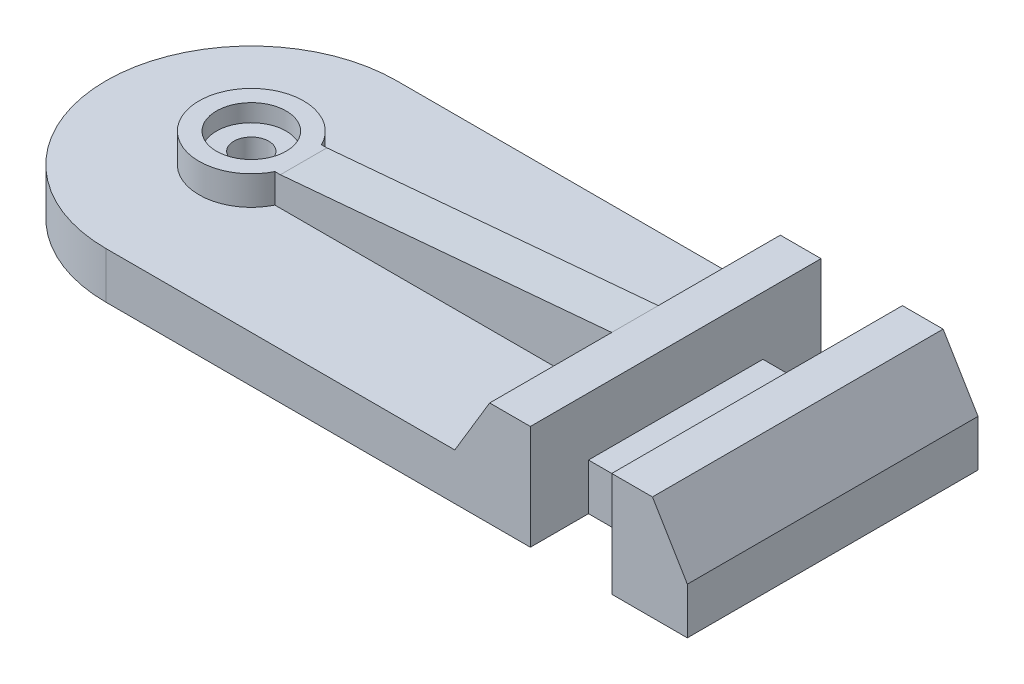
ISO-10303-21;
HEADER;
FILE_DESCRIPTION(('STEP AP214'),'2;1');
FILE_NAME('part.step','',(''),(''),'','','');
FILE_SCHEMA(('AUTOMOTIVE_DESIGN { 1 0 10303 214 1 1 1 1 }'));
ENDSEC;
DATA;
#1=APPLICATION_CONTEXT('core data for automotive mechanical design processes');
#2=APPLICATION_PROTOCOL_DEFINITION('international standard','automotive_design',2000,#1);
#3=PRODUCT_CONTEXT('',#1,'mechanical');
#4=PRODUCT('Part','Part','',(#3));
#5=PRODUCT_RELATED_PRODUCT_CATEGORY('part','',(#4));
#6=PRODUCT_DEFINITION_FORMATION('','',#4);
#7=PRODUCT_DEFINITION_CONTEXT('part definition',#1,'design');
#8=PRODUCT_DEFINITION('design','',#6,#7);
#9=PRODUCT_DEFINITION_SHAPE('','',#8);
#10=(LENGTH_UNIT() NAMED_UNIT(*) SI_UNIT(.MILLI.,.METRE.));
#11=(NAMED_UNIT(*) PLANE_ANGLE_UNIT() SI_UNIT($,.RADIAN.));
#12=(NAMED_UNIT(*) SI_UNIT($,.STERADIAN.) SOLID_ANGLE_UNIT());
#13=UNCERTAINTY_MEASURE_WITH_UNIT(LENGTH_MEASURE(1.E-05),#10,'distance_accuracy_value','');
#14=(GEOMETRIC_REPRESENTATION_CONTEXT(3) GLOBAL_UNCERTAINTY_ASSIGNED_CONTEXT((#13)) GLOBAL_UNIT_ASSIGNED_CONTEXT((#10,
#11,#12)) REPRESENTATION_CONTEXT('',''));
#15=CARTESIAN_POINT('',(0.,0.,0.));
#16=DIRECTION('',(0.,0.,1.));
#17=DIRECTION('',(1.,0.,0.));
#18=AXIS2_PLACEMENT_3D('',#15,#16,#17);
#19=CARTESIAN_POINT('',(0.,4.,0.));
#20=DIRECTION('',(0.,1.,0.));
#21=DIRECTION('',(0.,0.,1.));
#22=AXIS2_PLACEMENT_3D('',#19,#20,#21);
#23=PLANE('',#22);
#24=DIRECTION('',(0.,0.,1.));
#25=VECTOR('',#24,1.);
#26=CARTESIAN_POINT('',(30.,4.,-33.1155281280883));
#27=LINE('',#26,#25);
#28=CARTESIAN_POINT('',(30.,4.,2.));
#29=VERTEX_POINT('',#28);
#30=CARTESIAN_POINT('',(30.,4.,12.5));
#31=VERTEX_POINT('',#30);
#32=EDGE_CURVE('E189',#29,#31,#27,.T.);
#33=ORIENTED_EDGE('',*,*,#32,.F.);
#34=DIRECTION('',(1.,0.,0.));
#35=VECTOR('',#34,1.);
#36=CARTESIAN_POINT('',(3.21577289466308,4.,2.));
#37=LINE('',#36,#35);
#38=CARTESIAN_POINT('',(4.03112887414927,4.,2.));
#39=VERTEX_POINT('',#38);
#40=EDGE_CURVE('E173',#39,#29,#37,.T.);
#41=ORIENTED_EDGE('',*,*,#40,.F.);
#42=CARTESIAN_POINT('',(0.,4.,0.));
#43=DIRECTION('',(0.,1.,0.));
#44=DIRECTION('',(0.,0.,1.));
#45=AXIS2_PLACEMENT_3D('',#42,#43,#44);
#46=CIRCLE('',#45,4.5);
#47=CARTESIAN_POINT('',(4.03112887414927,4.,-2.));
#48=VERTEX_POINT('',#47);
#49=EDGE_CURVE('E218',#48,#39,#46,.T.);
#50=ORIENTED_EDGE('',*,*,#49,.F.);
#51=DIRECTION('',(1.,0.,0.));
#52=VECTOR('',#51,1.);
#53=CARTESIAN_POINT('',(3.21577289466308,4.,-2.));
#54=LINE('',#53,#52);
#55=CARTESIAN_POINT('',(30.,4.,-2.));
#56=VERTEX_POINT('',#55);
#57=EDGE_CURVE('E367',#48,#56,#54,.T.);
#58=ORIENTED_EDGE('',*,*,#57,.T.);
#59=CARTESIAN_POINT('',(30.,4.,-12.5));
#60=VERTEX_POINT('',#59);
#61=EDGE_CURVE('E197',#60,#56,#27,.T.);
#62=ORIENTED_EDGE('',*,*,#61,.F.);
#63=DIRECTION('',(1.,0.,0.));
#64=VECTOR('',#63,1.);
#65=CARTESIAN_POINT('',(0.,4.,-12.5));
#66=LINE('',#65,#64);
#67=CARTESIAN_POINT('',(0.,4.,-12.5));
#68=VERTEX_POINT('',#67);
#69=EDGE_CURVE('E229',#68,#60,#66,.T.);
#70=ORIENTED_EDGE('',*,*,#69,.F.);
#71=CARTESIAN_POINT('',(0.,4.,0.));
#72=DIRECTION('',(0.,1.,0.));
#73=DIRECTION('',(0.,0.,1.));
#74=AXIS2_PLACEMENT_3D('',#71,#72,#73);
#75=CIRCLE('',#74,12.5);
#76=CARTESIAN_POINT('',(0.,4.,12.5));
#77=VERTEX_POINT('',#76);
#78=EDGE_CURVE('E232',#68,#77,#75,.T.);
#79=ORIENTED_EDGE('',*,*,#78,.T.);
#80=DIRECTION('',(-1.,0.,0.));
#81=VECTOR('',#80,1.);
#82=CARTESIAN_POINT('',(0.,4.,12.5));
#83=LINE('',#82,#81);
#84=EDGE_CURVE('E196',#31,#77,#83,.T.);
#85=ORIENTED_EDGE('',*,*,#84,.F.);
#86=EDGE_LOOP('',(#33,#41,#50,#58,#62,#70,#79,#85));
#87=FACE_BOUND('',#86,.T.);
#88=ADVANCED_FACE('F37',(#87),#23,.T.);
#89=CARTESIAN_POINT('',(0.,6.5,0.));
#90=DIRECTION('',(0.,-1.,0.));
#91=DIRECTION('',(0.,0.,-1.));
#92=AXIS2_PLACEMENT_3D('',#89,#90,#91);
#93=CYLINDRICAL_SURFACE('',#92,4.5);
#94=DIRECTION('',(0.,-1.,0.));
#95=VECTOR('',#94,1.);
#96=CARTESIAN_POINT('',(4.03112887414927,6.5,2.));
#97=LINE('',#96,#95);
#98=CARTESIAN_POINT('',(4.03112887414927,6.5,2.));
#99=VERTEX_POINT('',#98);
#100=EDGE_CURVE('E179',#99,#39,#97,.T.);
#101=ORIENTED_EDGE('',*,*,#100,.F.);
#102=CARTESIAN_POINT('',(0.,6.5,0.));
#103=DIRECTION('',(0.,1.,0.));
#104=DIRECTION('',(0.,0.,1.));
#105=AXIS2_PLACEMENT_3D('',#102,#103,#104);
#106=CIRCLE('',#105,4.5);
#107=CARTESIAN_POINT('',(4.03112887414927,6.5,-2.));
#108=VERTEX_POINT('',#107);
#109=EDGE_CURVE('E219',#108,#99,#106,.T.);
#110=ORIENTED_EDGE('',*,*,#109,.F.);
#111=DIRECTION('',(0.,-1.,0.));
#112=VECTOR('',#111,1.);
#113=CARTESIAN_POINT('',(4.03112887414927,6.5,-2.));
#114=LINE('',#113,#112);
#115=EDGE_CURVE('E351',#108,#48,#114,.T.);
#116=ORIENTED_EDGE('',*,*,#115,.T.);
#117=ORIENTED_EDGE('',*,*,#49,.T.);
#118=EDGE_LOOP('',(#101,#110,#116,#117));
#119=FACE_BOUND('',#118,.T.);
#120=ADVANCED_FACE('F390',(#119),#93,.T.);
#121=CARTESIAN_POINT('',(33.,9.,-33.1155281280883));
#122=DIRECTION('',(-0.857492925712544,0.514495755427527,0.));
#123=DIRECTION('',(-0.514495755427527,-0.857492925712544,0.));
#124=AXIS2_PLACEMENT_3D('',#121,#122,#123);
#125=PLANE('',#124);
#126=DIRECTION('',(0.,0.,1.));
#127=VECTOR('',#126,1.);
#128=CARTESIAN_POINT('',(33.,9.,-33.1155281280883));
#129=LINE('',#128,#127);
#130=CARTESIAN_POINT('',(33.,9.,2.));
#131=VERTEX_POINT('',#130);
#132=CARTESIAN_POINT('',(33.,9.,12.5));
#133=VERTEX_POINT('',#132);
#134=EDGE_CURVE('E191',#131,#133,#129,.T.);
#135=ORIENTED_EDGE('',*,*,#134,.F.);
#136=DIRECTION('',(0.514495755427527,0.857492925712544,0.));
#137=VECTOR('',#136,1.);
#138=CARTESIAN_POINT('',(30.,4.,2.));
#139=LINE('',#138,#137);
#140=EDGE_CURVE('E176',#29,#131,#139,.T.);
#141=ORIENTED_EDGE('',*,*,#140,.F.);
#142=ORIENTED_EDGE('',*,*,#32,.T.);
#143=DIRECTION('',(-0.514495755427527,-0.857492925712544,0.));
#144=VECTOR('',#143,1.);
#145=CARTESIAN_POINT('',(33.,9.,12.5));
#146=LINE('',#145,#144);
#147=EDGE_CURVE('E302',#133,#31,#146,.T.);
#148=ORIENTED_EDGE('',*,*,#147,.F.);
#149=EDGE_LOOP('',(#135,#141,#142,#148));
#150=FACE_BOUND('',#149,.T.);
#151=ADVANCED_FACE('F187',(#150),#125,.T.);
#152=CARTESIAN_POINT('',(0.,4.,12.5));
#153=DIRECTION('',(0.,0.,1.));
#154=DIRECTION('',(1.,0.,0.));
#155=AXIS2_PLACEMENT_3D('',#152,#153,#154);
#156=PLANE('',#155);
#157=DIRECTION('',(-1.,0.,0.));
#158=VECTOR('',#157,1.);
#159=CARTESIAN_POINT('',(0.,0.,12.5));
#160=LINE('',#159,#158);
#161=CARTESIAN_POINT('',(36.5,0.,12.5));
#162=VERTEX_POINT('',#161);
#163=CARTESIAN_POINT('',(0.,0.,12.5));
#164=VERTEX_POINT('',#163);
#165=EDGE_CURVE('E237',#162,#164,#160,.T.);
#166=ORIENTED_EDGE('',*,*,#165,.F.);
#167=DIRECTION('',(0.,-1.,0.));
#168=VECTOR('',#167,1.);
#169=CARTESIAN_POINT('',(36.5,9.,12.5));
#170=LINE('',#169,#168);
#171=CARTESIAN_POINT('',(36.5,9.,12.5));
#172=VERTEX_POINT('',#171);
#173=EDGE_CURVE('E319',#172,#162,#170,.T.);
#174=ORIENTED_EDGE('',*,*,#173,.F.);
#175=DIRECTION('',(-1.,0.,0.));
#176=VECTOR('',#175,1.);
#177=CARTESIAN_POINT('',(33.,9.,12.5));
#178=LINE('',#177,#176);
#179=EDGE_CURVE('E292',#172,#133,#178,.T.);
#180=ORIENTED_EDGE('',*,*,#179,.T.);
#181=ORIENTED_EDGE('',*,*,#147,.T.);
#182=ORIENTED_EDGE('',*,*,#84,.T.);
#183=DIRECTION('',(0.,-1.,0.));
#184=VECTOR('',#183,1.);
#185=CARTESIAN_POINT('',(0.,4.,12.5));
#186=LINE('',#185,#184);
#187=EDGE_CURVE('E234',#77,#164,#186,.T.);
#188=ORIENTED_EDGE('',*,*,#187,.T.);
#189=EDGE_LOOP('',(#166,#174,#180,#181,#182,#188));
#190=FACE_BOUND('',#189,.T.);
#191=ADVANCED_FACE('F416',(#190),#156,.T.);
#192=CARTESIAN_POINT('',(0.,4.,-12.5));
#193=DIRECTION('',(0.,0.,-1.));
#194=DIRECTION('',(-1.,0.,0.));
#195=AXIS2_PLACEMENT_3D('',#192,#193,#194);
#196=PLANE('',#195);
#197=DIRECTION('',(0.,-1.,0.));
#198=VECTOR('',#197,1.);
#199=CARTESIAN_POINT('',(36.5,9.,-12.5));
#200=LINE('',#199,#198);
#201=CARTESIAN_POINT('',(36.5,9.,-12.5));
#202=VERTEX_POINT('',#201);
#203=CARTESIAN_POINT('',(36.5,0.,-12.5));
#204=VERTEX_POINT('',#203);
#205=EDGE_CURVE('E312',#202,#204,#200,.T.);
#206=ORIENTED_EDGE('',*,*,#205,.T.);
#207=DIRECTION('',(1.,0.,0.));
#208=VECTOR('',#207,1.);
#209=CARTESIAN_POINT('',(0.,0.,-12.5));
#210=LINE('',#209,#208);
#211=CARTESIAN_POINT('',(0.,0.,-12.5));
#212=VERTEX_POINT('',#211);
#213=EDGE_CURVE('E245',#212,#204,#210,.T.);
#214=ORIENTED_EDGE('',*,*,#213,.F.);
#215=DIRECTION('',(0.,-1.,0.));
#216=VECTOR('',#215,1.);
#217=CARTESIAN_POINT('',(0.,4.,-12.5));
#218=LINE('',#217,#216);
#219=EDGE_CURVE('E255',#68,#212,#218,.T.);
#220=ORIENTED_EDGE('',*,*,#219,.F.);
#221=ORIENTED_EDGE('',*,*,#69,.T.);
#222=DIRECTION('',(-0.514495755427527,-0.857492925712544,0.));
#223=VECTOR('',#222,1.);
#224=CARTESIAN_POINT('',(33.,9.,-12.5));
#225=LINE('',#224,#223);
#226=CARTESIAN_POINT('',(33.,9.,-12.5));
#227=VERTEX_POINT('',#226);
#228=EDGE_CURVE('E198',#227,#60,#225,.T.);
#229=ORIENTED_EDGE('',*,*,#228,.F.);
#230=DIRECTION('',(-1.,0.,0.));
#231=VECTOR('',#230,1.);
#232=CARTESIAN_POINT('',(33.,9.,-12.5));
#233=LINE('',#232,#231);
#234=EDGE_CURVE('E299',#202,#227,#233,.T.);
#235=ORIENTED_EDGE('',*,*,#234,.F.);
#236=EDGE_LOOP('',(#206,#214,#220,#221,#229,#235));
#237=FACE_BOUND('',#236,.T.);
#238=ADVANCED_FACE('F412',(#237),#196,.T.);
#239=CARTESIAN_POINT('',(33.,9.,-33.1155281280883));
#240=DIRECTION('',(0.,1.,0.));
#241=DIRECTION('',(0.,0.,1.));
#242=AXIS2_PLACEMENT_3D('',#239,#240,#241);
#243=PLANE('',#242);
#244=DIRECTION('',(0.,0.,1.));
#245=VECTOR('',#244,1.);
#246=CARTESIAN_POINT('',(43.5,9.,-12.5));
#247=LINE('',#246,#245);
#248=CARTESIAN_POINT('',(43.5,9.,-12.5));
#249=VERTEX_POINT('',#248);
#250=CARTESIAN_POINT('',(43.5,9.,12.5));
#251=VERTEX_POINT('',#250);
#252=EDGE_CURVE('E309',#249,#251,#247,.T.);
#253=ORIENTED_EDGE('',*,*,#252,.T.);
#254=CARTESIAN_POINT('',(47.,9.,12.5));
#255=VERTEX_POINT('',#254);
#256=EDGE_CURVE('E295',#255,#251,#178,.T.);
#257=ORIENTED_EDGE('',*,*,#256,.F.);
#258=DIRECTION('',(0.,0.,1.));
#259=VECTOR('',#258,1.);
#260=CARTESIAN_POINT('',(47.,9.,-33.1155281280883));
#261=LINE('',#260,#259);
#262=CARTESIAN_POINT('',(47.,9.,-12.5));
#263=VERTEX_POINT('',#262);
#264=EDGE_CURVE('E208',#263,#255,#261,.T.);
#265=ORIENTED_EDGE('',*,*,#264,.F.);
#266=EDGE_CURVE('E287',#263,#249,#233,.T.);
#267=ORIENTED_EDGE('',*,*,#266,.T.);
#268=EDGE_LOOP('',(#253,#257,#265,#267));
#269=FACE_BOUND('',#268,.T.);
#270=ADVANCED_FACE('F415',(#269),#243,.T.);
#271=DIRECTION('',(0.,1.,0.));
#272=VECTOR('',#271,1.);
#273=CARTESIAN_POINT('',(43.5,9.,12.5));
#274=LINE('',#273,#272);
#275=CARTESIAN_POINT('',(43.5,0.,12.5));
#276=VERTEX_POINT('',#275);
#277=EDGE_CURVE('E270',#276,#251,#274,.T.);
#278=ORIENTED_EDGE('',*,*,#277,.F.);
#279=CARTESIAN_POINT('',(50.,0.,12.5));
#280=VERTEX_POINT('',#279);
#281=EDGE_CURVE('E238',#280,#276,#160,.T.);
#282=ORIENTED_EDGE('',*,*,#281,.F.);
#283=DIRECTION('',(0.,-1.,0.));
#284=VECTOR('',#283,1.);
#285=CARTESIAN_POINT('',(50.,4.,12.5));
#286=LINE('',#285,#284);
#287=CARTESIAN_POINT('',(50.,4.,12.5));
#288=VERTEX_POINT('',#287);
#289=EDGE_CURVE('E45',#288,#280,#286,.T.);
#290=ORIENTED_EDGE('',*,*,#289,.F.);
#291=DIRECTION('',(-0.514495755427527,0.857492925712544,0.));
#292=VECTOR('',#291,1.);
#293=CARTESIAN_POINT('',(47.,9.,12.5));
#294=LINE('',#293,#292);
#295=EDGE_CURVE('E214',#288,#255,#294,.T.);
#296=ORIENTED_EDGE('',*,*,#295,.T.);
#297=ORIENTED_EDGE('',*,*,#256,.T.);
#298=EDGE_LOOP('',(#278,#282,#290,#296,#297));
#299=FACE_BOUND('',#298,.T.);
#300=ADVANCED_FACE('F268',(#299),#156,.T.);
#301=CARTESIAN_POINT('',(50.,4.,0.));
#302=DIRECTION('',(1.,0.,0.));
#303=DIRECTION('',(0.,0.,-1.));
#304=AXIS2_PLACEMENT_3D('',#301,#302,#303);
#305=PLANE('',#304);
#306=DIRECTION('',(0.,0.,1.));
#307=VECTOR('',#306,1.);
#308=CARTESIAN_POINT('',(50.,0.,0.));
#309=LINE('',#308,#307);
#310=CARTESIAN_POINT('',(50.,0.,-12.5));
#311=VERTEX_POINT('',#310);
#312=EDGE_CURVE('E241',#311,#280,#309,.T.);
#313=ORIENTED_EDGE('',*,*,#312,.F.);
#314=DIRECTION('',(0.,-1.,0.));
#315=VECTOR('',#314,1.);
#316=CARTESIAN_POINT('',(50.,4.,-12.5));
#317=LINE('',#316,#315);
#318=CARTESIAN_POINT('',(50.,4.,-12.5));
#319=VERTEX_POINT('',#318);
#320=EDGE_CURVE('E257',#319,#311,#317,.T.);
#321=ORIENTED_EDGE('',*,*,#320,.F.);
#322=DIRECTION('',(0.,0.,1.));
#323=VECTOR('',#322,1.);
#324=CARTESIAN_POINT('',(50.,4.,0.));
#325=LINE('',#324,#323);
#326=EDGE_CURVE('E225',#319,#288,#325,.T.);
#327=ORIENTED_EDGE('',*,*,#326,.T.);
#328=ORIENTED_EDGE('',*,*,#289,.T.);
#329=EDGE_LOOP('',(#313,#321,#327,#328));
#330=FACE_BOUND('',#329,.T.);
#331=ADVANCED_FACE('F263',(#330),#305,.T.);
#332=CARTESIAN_POINT('',(43.5,0.,-12.5));
#333=VERTEX_POINT('',#332);
#334=EDGE_CURVE('E244',#333,#311,#210,.T.);
#335=ORIENTED_EDGE('',*,*,#334,.F.);
#336=DIRECTION('',(0.,1.,0.));
#337=VECTOR('',#336,1.);
#338=CARTESIAN_POINT('',(43.5,9.,-12.5));
#339=LINE('',#338,#337);
#340=EDGE_CURVE('E321',#333,#249,#339,.T.);
#341=ORIENTED_EDGE('',*,*,#340,.T.);
#342=ORIENTED_EDGE('',*,*,#266,.F.);
#343=DIRECTION('',(-0.514495755427527,0.857492925712544,0.));
#344=VECTOR('',#343,1.);
#345=CARTESIAN_POINT('',(47.,9.,-12.5));
#346=LINE('',#345,#344);
#347=EDGE_CURVE('E201',#319,#263,#346,.T.);
#348=ORIENTED_EDGE('',*,*,#347,.F.);
#349=ORIENTED_EDGE('',*,*,#320,.T.);
#350=EDGE_LOOP('',(#335,#341,#342,#348,#349));
#351=FACE_BOUND('',#350,.T.);
#352=ADVANCED_FACE('F284',(#351),#196,.T.);
#353=CARTESIAN_POINT('',(0.,4.,0.));
#354=DIRECTION('',(0.,-1.,0.));
#355=DIRECTION('',(0.,0.,-1.));
#356=AXIS2_PLACEMENT_3D('',#353,#354,#355);
#357=CYLINDRICAL_SURFACE('',#356,12.5);
#358=CARTESIAN_POINT('',(0.,0.,0.));
#359=DIRECTION('',(0.,1.,0.));
#360=DIRECTION('',(0.,0.,1.));
#361=AXIS2_PLACEMENT_3D('',#358,#359,#360);
#362=CIRCLE('',#361,12.5);
#363=EDGE_CURVE('E248',#212,#164,#362,.T.);
#364=ORIENTED_EDGE('',*,*,#363,.T.);
#365=ORIENTED_EDGE('',*,*,#187,.F.);
#366=ORIENTED_EDGE('',*,*,#78,.F.);
#367=ORIENTED_EDGE('',*,*,#219,.T.);
#368=EDGE_LOOP('',(#364,#365,#366,#367));
#369=FACE_BOUND('',#368,.T.);
#370=ADVANCED_FACE('F406',(#369),#357,.T.);
#371=CARTESIAN_POINT('',(40.,4.,0.));
#372=DIRECTION('',(0.,-1.,0.));
#373=DIRECTION('',(0.,0.,-1.));
#374=AXIS2_PLACEMENT_3D('',#371,#372,#373);
#375=CYLINDRICAL_SURFACE('',#374,1.5);
#376=CARTESIAN_POINT('',(40.,4.,0.));
#377=DIRECTION('',(0.,-1.,0.));
#378=DIRECTION('',(0.,0.,-1.));
#379=AXIS2_PLACEMENT_3D('',#376,#377,#378);
#380=CIRCLE('',#379,1.5);
#381=CARTESIAN_POINT('',(40.,4.,-1.5));
#382=VERTEX_POINT('',#381);
#383=EDGE_CURVE('E211',#382,#382,#380,.T.);
#384=ORIENTED_EDGE('',*,*,#383,.F.);
#385=EDGE_LOOP('',(#384));
#386=FACE_BOUND('',#385,.T.);
#387=CARTESIAN_POINT('',(40.,0.,0.));
#388=DIRECTION('',(0.,1.,0.));
#389=DIRECTION('',(0.,0.,1.));
#390=AXIS2_PLACEMENT_3D('',#387,#388,#389);
#391=CIRCLE('',#390,1.5);
#392=CARTESIAN_POINT('',(40.,0.,1.5));
#393=VERTEX_POINT('',#392);
#394=EDGE_CURVE('E222',#393,#393,#391,.T.);
#395=ORIENTED_EDGE('',*,*,#394,.F.);
#396=EDGE_LOOP('',(#395));
#397=FACE_BOUND('',#396,.T.);
#398=ADVANCED_FACE('F39',(#386,#397),#375,.F.);
#399=CARTESIAN_POINT('',(0.,4.,0.));
#400=DIRECTION('',(0.,-1.,0.));
#401=DIRECTION('',(0.,0.,-1.));
#402=AXIS2_PLACEMENT_3D('',#399,#400,#401);
#403=CYLINDRICAL_SURFACE('',#402,1.5);
#404=CARTESIAN_POINT('',(0.,0.,0.));
#405=DIRECTION('',(0.,1.,0.));
#406=DIRECTION('',(0.,0.,1.));
#407=AXIS2_PLACEMENT_3D('',#404,#405,#406);
#408=CIRCLE('',#407,1.5);
#409=CARTESIAN_POINT('',(0.,0.,1.5));
#410=VERTEX_POINT('',#409);
#411=EDGE_CURVE('E226',#410,#410,#408,.T.);
#412=ORIENTED_EDGE('',*,*,#411,.F.);
#413=EDGE_LOOP('',(#412));
#414=FACE_BOUND('',#413,.T.);
#415=CARTESIAN_POINT('',(0.,5.,0.));
#416=DIRECTION('',(0.,1.,0.));
#417=DIRECTION('',(0.,0.,1.));
#418=AXIS2_PLACEMENT_3D('',#415,#416,#417);
#419=CIRCLE('',#418,1.5);
#420=CARTESIAN_POINT('',(0.,5.,1.5));
#421=VERTEX_POINT('',#420);
#422=EDGE_CURVE('E370',#421,#421,#419,.T.);
#423=ORIENTED_EDGE('',*,*,#422,.T.);
#424=EDGE_LOOP('',(#423));
#425=FACE_BOUND('',#424,.T.);
#426=ADVANCED_FACE('F376',(#414,#425),#403,.F.);
#427=CARTESIAN_POINT('',(0.,0.,0.));
#428=DIRECTION('',(0.,1.,0.));
#429=DIRECTION('',(0.,0.,1.));
#430=AXIS2_PLACEMENT_3D('',#427,#428,#429);
#431=PLANE('',#430);
#432=ORIENTED_EDGE('',*,*,#394,.T.);
#433=EDGE_LOOP('',(#432));
#434=FACE_BOUND('',#433,.T.);
#435=DIRECTION('',(-1.,0.,0.));
#436=VECTOR('',#435,1.);
#437=CARTESIAN_POINT('',(43.5,0.,7.5));
#438=LINE('',#437,#436);
#439=CARTESIAN_POINT('',(43.5,0.,7.5));
#440=VERTEX_POINT('',#439);
#441=CARTESIAN_POINT('',(36.5,0.,7.50000000000001));
#442=VERTEX_POINT('',#441);
#443=EDGE_CURVE('E341',#440,#442,#438,.T.);
#444=ORIENTED_EDGE('',*,*,#443,.T.);
#445=DIRECTION('',(0.,0.,1.));
#446=VECTOR('',#445,1.);
#447=CARTESIAN_POINT('',(36.5,0.,7.50000000000001));
#448=LINE('',#447,#446);
#449=EDGE_CURVE('E344',#442,#162,#448,.T.);
#450=ORIENTED_EDGE('',*,*,#449,.T.);
#451=ORIENTED_EDGE('',*,*,#165,.T.);
#452=ORIENTED_EDGE('',*,*,#363,.F.);
#453=ORIENTED_EDGE('',*,*,#213,.T.);
#454=DIRECTION('',(0.,0.,1.));
#455=VECTOR('',#454,1.);
#456=CARTESIAN_POINT('',(36.5,0.,-7.50000000000001));
#457=LINE('',#456,#455);
#458=CARTESIAN_POINT('',(36.5,0.,-7.50000000000001));
#459=VERTEX_POINT('',#458);
#460=EDGE_CURVE('E329',#204,#459,#457,.T.);
#461=ORIENTED_EDGE('',*,*,#460,.T.);
#462=DIRECTION('',(1.,0.,0.));
#463=VECTOR('',#462,1.);
#464=CARTESIAN_POINT('',(43.5,0.,-7.5));
#465=LINE('',#464,#463);
#466=CARTESIAN_POINT('',(43.5,0.,-7.5));
#467=VERTEX_POINT('',#466);
#468=EDGE_CURVE('E334',#459,#467,#465,.T.);
#469=ORIENTED_EDGE('',*,*,#468,.T.);
#470=DIRECTION('',(0.,0.,-1.));
#471=VECTOR('',#470,1.);
#472=CARTESIAN_POINT('',(43.5,0.,-12.5));
#473=LINE('',#472,#471);
#474=EDGE_CURVE('E281',#467,#333,#473,.T.);
#475=ORIENTED_EDGE('',*,*,#474,.T.);
#476=ORIENTED_EDGE('',*,*,#334,.T.);
#477=ORIENTED_EDGE('',*,*,#312,.T.);
#478=ORIENTED_EDGE('',*,*,#281,.T.);
#479=DIRECTION('',(0.,0.,-1.));
#480=VECTOR('',#479,1.);
#481=CARTESIAN_POINT('',(43.5,0.,12.5));
#482=LINE('',#481,#480);
#483=EDGE_CURVE('E346',#276,#440,#482,.T.);
#484=ORIENTED_EDGE('',*,*,#483,.T.);
#485=EDGE_LOOP('',(#444,#450,#451,#452,#453,#461,#469,#475,#476,#477,#478,#484));
#486=FACE_BOUND('',#485,.T.);
#487=ORIENTED_EDGE('',*,*,#411,.T.);
#488=EDGE_LOOP('',(#487));
#489=FACE_BOUND('',#488,.T.);
#490=ADVANCED_FACE('F275',(#434,#486,#489),#431,.F.);
#491=CARTESIAN_POINT('',(0.,6.5,0.));
#492=DIRECTION('',(0.,1.,0.));
#493=DIRECTION('',(0.,0.,1.));
#494=AXIS2_PLACEMENT_3D('',#491,#492,#493);
#495=PLANE('',#494);
#496=ORIENTED_EDGE('',*,*,#109,.T.);
#497=DIRECTION('',(-1.,0.,0.));
#498=VECTOR('',#497,1.);
#499=CARTESIAN_POINT('',(4.5,6.5,2.));
#500=LINE('',#499,#498);
#501=CARTESIAN_POINT('',(4.5,6.5,2.));
#502=VERTEX_POINT('',#501);
#503=EDGE_CURVE('E358',#502,#99,#500,.T.);
#504=ORIENTED_EDGE('',*,*,#503,.F.);
#505=DIRECTION('',(0.,0.,-1.));
#506=VECTOR('',#505,1.);
#507=CARTESIAN_POINT('',(4.5,6.5,2.));
#508=LINE('',#507,#506);
#509=CARTESIAN_POINT('',(4.5,6.5,-2.));
#510=VERTEX_POINT('',#509);
#511=EDGE_CURVE('E356',#502,#510,#508,.T.);
#512=ORIENTED_EDGE('',*,*,#511,.T.);
#513=DIRECTION('',(-1.,0.,0.));
#514=VECTOR('',#513,1.);
#515=CARTESIAN_POINT('',(4.5,6.5,-2.));
#516=LINE('',#515,#514);
#517=EDGE_CURVE('E184',#510,#108,#516,.T.);
#518=ORIENTED_EDGE('',*,*,#517,.T.);
#519=EDGE_LOOP('',(#496,#504,#512,#518));
#520=FACE_BOUND('',#519,.T.);
#521=CARTESIAN_POINT('',(0.,6.5,0.));
#522=DIRECTION('',(0.,1.,0.));
#523=DIRECTION('',(0.,0.,1.));
#524=AXIS2_PLACEMENT_3D('',#521,#522,#523);
#525=CIRCLE('',#524,3.);
#526=CARTESIAN_POINT('',(0.,6.5,3.));
#527=VERTEX_POINT('',#526);
#528=EDGE_CURVE('E210',#527,#527,#525,.T.);
#529=ORIENTED_EDGE('',*,*,#528,.F.);
#530=EDGE_LOOP('',(#529));
#531=FACE_BOUND('',#530,.T.);
#532=ADVANCED_FACE('F401',(#520,#531),#495,.T.);
#533=CARTESIAN_POINT('',(0.,6.5,0.));
#534=DIRECTION('',(0.,-1.,0.));
#535=DIRECTION('',(0.,0.,-1.));
#536=AXIS2_PLACEMENT_3D('',#533,#534,#535);
#537=CYLINDRICAL_SURFACE('',#536,3.);
#538=CARTESIAN_POINT('',(0.,5.,0.));
#539=DIRECTION('',(0.,1.,0.));
#540=DIRECTION('',(0.,0.,1.));
#541=AXIS2_PLACEMENT_3D('',#538,#539,#540);
#542=CIRCLE('',#541,3.);
#543=CARTESIAN_POINT('',(0.,5.,3.));
#544=VERTEX_POINT('',#543);
#545=EDGE_CURVE('E11',#544,#544,#542,.T.);
#546=ORIENTED_EDGE('',*,*,#545,.F.);
#547=EDGE_LOOP('',(#546));
#548=FACE_BOUND('',#547,.T.);
#549=ORIENTED_EDGE('',*,*,#528,.T.);
#550=EDGE_LOOP('',(#549));
#551=FACE_BOUND('',#550,.T.);
#552=ADVANCED_FACE('F480',(#548,#551),#537,.F.);
#553=CARTESIAN_POINT('',(47.,9.,-33.1155281280883));
#554=DIRECTION('',(0.857492925712544,0.514495755427527,0.));
#555=DIRECTION('',(-0.514495755427527,0.857492925712544,0.));
#556=AXIS2_PLACEMENT_3D('',#553,#554,#555);
#557=PLANE('',#556);
#558=ORIENTED_EDGE('',*,*,#326,.F.);
#559=ORIENTED_EDGE('',*,*,#347,.T.);
#560=ORIENTED_EDGE('',*,*,#264,.T.);
#561=ORIENTED_EDGE('',*,*,#295,.F.);
#562=EDGE_LOOP('',(#558,#559,#560,#561));
#563=FACE_BOUND('',#562,.T.);
#564=ADVANCED_FACE('F290',(#563),#557,.T.);
#565=DIRECTION('',(0.514495755427527,0.857492925712544,0.));
#566=VECTOR('',#565,1.);
#567=CARTESIAN_POINT('',(30.,4.,-2.));
#568=LINE('',#567,#566);
#569=CARTESIAN_POINT('',(33.,9.,-2.));
#570=VERTEX_POINT('',#569);
#571=EDGE_CURVE('E364',#56,#570,#568,.T.);
#572=ORIENTED_EDGE('',*,*,#571,.T.);
#573=EDGE_CURVE('E202',#227,#570,#129,.T.);
#574=ORIENTED_EDGE('',*,*,#573,.F.);
#575=ORIENTED_EDGE('',*,*,#228,.T.);
#576=ORIENTED_EDGE('',*,*,#61,.T.);
#577=EDGE_LOOP('',(#572,#574,#575,#576));
#578=FACE_BOUND('',#577,.T.);
#579=ADVANCED_FACE('F429',(#578),#125,.T.);
#580=DIRECTION('',(0.,0.,1.));
#581=VECTOR('',#580,1.);
#582=CARTESIAN_POINT('',(36.5,9.,-12.5));
#583=LINE('',#582,#581);
#584=EDGE_CURVE('E311',#202,#172,#583,.T.);
#585=ORIENTED_EDGE('',*,*,#584,.F.);
#586=ORIENTED_EDGE('',*,*,#234,.T.);
#587=ORIENTED_EDGE('',*,*,#573,.T.);
#588=DIRECTION('',(0.,0.,-1.));
#589=VECTOR('',#588,1.);
#590=CARTESIAN_POINT('',(33.,9.,2.));
#591=LINE('',#590,#589);
#592=EDGE_CURVE('E354',#131,#570,#591,.T.);
#593=ORIENTED_EDGE('',*,*,#592,.F.);
#594=ORIENTED_EDGE('',*,*,#134,.T.);
#595=ORIENTED_EDGE('',*,*,#179,.F.);
#596=EDGE_LOOP('',(#585,#586,#587,#593,#594,#595));
#597=FACE_BOUND('',#596,.T.);
#598=ADVANCED_FACE('F421',(#597),#243,.T.);
#599=CARTESIAN_POINT('',(43.5,9.,-12.5));
#600=DIRECTION('',(1.,0.,0.));
#601=DIRECTION('',(0.,0.,-1.));
#602=AXIS2_PLACEMENT_3D('',#599,#600,#601);
#603=PLANE('',#602);
#604=ORIENTED_EDGE('',*,*,#277,.T.);
#605=ORIENTED_EDGE('',*,*,#252,.F.);
#606=ORIENTED_EDGE('',*,*,#340,.F.);
#607=ORIENTED_EDGE('',*,*,#474,.F.);
#608=DIRECTION('',(0.,1.,0.));
#609=VECTOR('',#608,1.);
#610=CARTESIAN_POINT('',(43.5,0.,-7.5));
#611=LINE('',#610,#609);
#612=CARTESIAN_POINT('',(43.5,4.,-7.5));
#613=VERTEX_POINT('',#612);
#614=EDGE_CURVE('E326',#467,#613,#611,.T.);
#615=ORIENTED_EDGE('',*,*,#614,.T.);
#616=DIRECTION('',(0.,0.,1.));
#617=VECTOR('',#616,1.);
#618=CARTESIAN_POINT('',(43.5,4.,-12.5));
#619=LINE('',#618,#617);
#620=CARTESIAN_POINT('',(43.5,4.,7.5));
#621=VERTEX_POINT('',#620);
#622=EDGE_CURVE('E215',#613,#621,#619,.T.);
#623=ORIENTED_EDGE('',*,*,#622,.T.);
#624=DIRECTION('',(0.,1.,0.));
#625=VECTOR('',#624,1.);
#626=CARTESIAN_POINT('',(43.5,0.,7.5));
#627=LINE('',#626,#625);
#628=EDGE_CURVE('E339',#440,#621,#627,.T.);
#629=ORIENTED_EDGE('',*,*,#628,.F.);
#630=ORIENTED_EDGE('',*,*,#483,.F.);
#631=EDGE_LOOP('',(#604,#605,#606,#607,#615,#623,#629,#630));
#632=FACE_BOUND('',#631,.T.);
#633=ADVANCED_FACE('F460',(#632),#603,.F.);
#634=CARTESIAN_POINT('',(43.5,4.,-12.5));
#635=DIRECTION('',(0.,-1.,0.));
#636=DIRECTION('',(1.,0.,0.));
#637=AXIS2_PLACEMENT_3D('',#634,#635,#636);
#638=PLANE('',#637);
#639=ORIENTED_EDGE('',*,*,#383,.T.);
#640=EDGE_LOOP('',(#639));
#641=FACE_BOUND('',#640,.T.);
#642=DIRECTION('',(0.,0.,1.));
#643=VECTOR('',#642,1.);
#644=CARTESIAN_POINT('',(36.5,4.,-12.5));
#645=LINE('',#644,#643);
#646=CARTESIAN_POINT('',(36.5,4.,-7.50000000000001));
#647=VERTEX_POINT('',#646);
#648=CARTESIAN_POINT('',(36.5,4.,7.50000000000001));
#649=VERTEX_POINT('',#648);
#650=EDGE_CURVE('E314',#647,#649,#645,.T.);
#651=ORIENTED_EDGE('',*,*,#650,.T.);
#652=DIRECTION('',(-1.,0.,0.));
#653=VECTOR('',#652,1.);
#654=CARTESIAN_POINT('',(43.5,4.,7.5));
#655=LINE('',#654,#653);
#656=EDGE_CURVE('E60',#621,#649,#655,.T.);
#657=ORIENTED_EDGE('',*,*,#656,.F.);
#658=ORIENTED_EDGE('',*,*,#622,.F.);
#659=DIRECTION('',(1.,0.,0.));
#660=VECTOR('',#659,1.);
#661=CARTESIAN_POINT('',(43.5,4.,-7.5));
#662=LINE('',#661,#660);
#663=EDGE_CURVE('E331',#647,#613,#662,.T.);
#664=ORIENTED_EDGE('',*,*,#663,.F.);
#665=EDGE_LOOP('',(#651,#657,#658,#664));
#666=FACE_BOUND('',#665,.T.);
#667=ADVANCED_FACE('F471',(#641,#666),#638,.F.);
#668=CARTESIAN_POINT('',(36.5,9.,-12.5));
#669=DIRECTION('',(-1.,0.,0.));
#670=DIRECTION('',(0.,0.,1.));
#671=AXIS2_PLACEMENT_3D('',#668,#669,#670);
#672=PLANE('',#671);
#673=ORIENTED_EDGE('',*,*,#173,.T.);
#674=ORIENTED_EDGE('',*,*,#449,.F.);
#675=DIRECTION('',(0.,1.,0.));
#676=VECTOR('',#675,1.);
#677=CARTESIAN_POINT('',(36.5,0.,7.50000000000001));
#678=LINE('',#677,#676);
#679=EDGE_CURVE('E323',#442,#649,#678,.T.);
#680=ORIENTED_EDGE('',*,*,#679,.T.);
#681=ORIENTED_EDGE('',*,*,#650,.F.);
#682=DIRECTION('',(0.,1.,0.));
#683=VECTOR('',#682,1.);
#684=CARTESIAN_POINT('',(36.5,0.,-7.50000000000001));
#685=LINE('',#684,#683);
#686=EDGE_CURVE('E328',#459,#647,#685,.T.);
#687=ORIENTED_EDGE('',*,*,#686,.F.);
#688=ORIENTED_EDGE('',*,*,#460,.F.);
#689=ORIENTED_EDGE('',*,*,#205,.F.);
#690=ORIENTED_EDGE('',*,*,#584,.T.);
#691=EDGE_LOOP('',(#673,#674,#680,#681,#687,#688,#689,#690));
#692=FACE_BOUND('',#691,.T.);
#693=ADVANCED_FACE('F439',(#692),#672,.F.);
#694=CARTESIAN_POINT('',(43.5,0.,-7.5));
#695=DIRECTION('',(0.,0.,1.));
#696=DIRECTION('',(1.,0.,0.));
#697=AXIS2_PLACEMENT_3D('',#694,#695,#696);
#698=PLANE('',#697);
#699=ORIENTED_EDGE('',*,*,#663,.T.);
#700=ORIENTED_EDGE('',*,*,#614,.F.);
#701=ORIENTED_EDGE('',*,*,#468,.F.);
#702=ORIENTED_EDGE('',*,*,#686,.T.);
#703=EDGE_LOOP('',(#699,#700,#701,#702));
#704=FACE_BOUND('',#703,.T.);
#705=ADVANCED_FACE('F457',(#704),#698,.F.);
#706=CARTESIAN_POINT('',(43.5,0.,7.5));
#707=DIRECTION('',(0.,0.,-1.));
#708=DIRECTION('',(-1.,0.,0.));
#709=AXIS2_PLACEMENT_3D('',#706,#707,#708);
#710=PLANE('',#709);
#711=ORIENTED_EDGE('',*,*,#656,.T.);
#712=ORIENTED_EDGE('',*,*,#679,.F.);
#713=ORIENTED_EDGE('',*,*,#443,.F.);
#714=ORIENTED_EDGE('',*,*,#628,.T.);
#715=EDGE_LOOP('',(#711,#712,#713,#714));
#716=FACE_BOUND('',#715,.T.);
#717=ADVANCED_FACE('F461',(#716),#710,.F.);
#718=CARTESIAN_POINT('',(0.,0.,2.));
#719=DIRECTION('',(0.,0.,-1.));
#720=DIRECTION('',(-1.,0.,0.));
#721=AXIS2_PLACEMENT_3D('',#718,#719,#720);
#722=PLANE('',#721);
#723=ORIENTED_EDGE('',*,*,#503,.T.);
#724=ORIENTED_EDGE('',*,*,#100,.T.);
#725=ORIENTED_EDGE('',*,*,#40,.T.);
#726=ORIENTED_EDGE('',*,*,#140,.T.);
#727=DIRECTION('',(-0.996174723949222,-0.0873837477148439,0.));
#728=VECTOR('',#727,1.);
#729=CARTESIAN_POINT('',(33.,9.,2.));
#730=LINE('',#729,#728);
#731=EDGE_CURVE('E52',#131,#502,#730,.T.);
#732=ORIENTED_EDGE('',*,*,#731,.T.);
#733=EDGE_LOOP('',(#723,#724,#725,#726,#732));
#734=FACE_BOUND('',#733,.T.);
#735=ADVANCED_FACE('F175',(#734),#722,.F.);
#736=CARTESIAN_POINT('',(0.,0.,-2.));
#737=DIRECTION('',(0.,0.,-1.));
#738=DIRECTION('',(-1.,0.,0.));
#739=AXIS2_PLACEMENT_3D('',#736,#737,#738);
#740=PLANE('',#739);
#741=ORIENTED_EDGE('',*,*,#115,.F.);
#742=ORIENTED_EDGE('',*,*,#517,.F.);
#743=DIRECTION('',(-0.996174723949222,-0.0873837477148439,0.));
#744=VECTOR('',#743,1.);
#745=CARTESIAN_POINT('',(33.,9.,-2.));
#746=LINE('',#745,#744);
#747=EDGE_CURVE('E361',#570,#510,#746,.T.);
#748=ORIENTED_EDGE('',*,*,#747,.F.);
#749=ORIENTED_EDGE('',*,*,#571,.F.);
#750=ORIENTED_EDGE('',*,*,#57,.F.);
#751=EDGE_LOOP('',(#741,#742,#748,#749,#750));
#752=FACE_BOUND('',#751,.T.);
#753=ADVANCED_FACE('F386',(#752),#740,.T.);
#754=CARTESIAN_POINT('',(33.,9.,2.));
#755=DIRECTION('',(0.0873837477148439,-0.996174723949222,0.));
#756=DIRECTION('',(0.996174723949222,0.0873837477148439,0.));
#757=AXIS2_PLACEMENT_3D('',#754,#755,#756);
#758=PLANE('',#757);
#759=ORIENTED_EDGE('',*,*,#747,.T.);
#760=ORIENTED_EDGE('',*,*,#511,.F.);
#761=ORIENTED_EDGE('',*,*,#731,.F.);
#762=ORIENTED_EDGE('',*,*,#592,.T.);
#763=EDGE_LOOP('',(#759,#760,#761,#762));
#764=FACE_BOUND('',#763,.T.);
#765=ADVANCED_FACE('F380',(#764),#758,.F.);
#766=CARTESIAN_POINT('',(0.,5.,0.));
#767=DIRECTION('',(0.,1.,0.));
#768=DIRECTION('',(0.,0.,1.));
#769=AXIS2_PLACEMENT_3D('',#766,#767,#768);
#770=PLANE('',#769);
#771=ORIENTED_EDGE('',*,*,#545,.T.);
#772=EDGE_LOOP('',(#771));
#773=FACE_BOUND('',#772,.T.);
#774=ORIENTED_EDGE('',*,*,#422,.F.);
#775=EDGE_LOOP('',(#774));
#776=FACE_BOUND('',#775,.T.);
#777=ADVANCED_FACE('F378',(#773,#776),#770,.T.);
#778=CLOSED_SHELL('',(#88,#120,#151,#191,#238,#270,#300,#331,#352,#370,#398,#426,#490,#532,#552,
#564,#579,#598,#633,#667,#693,#705,#717,#735,#753,#765,#777));
#779=MANIFOLD_SOLID_BREP('B2',#778);
#780=ADVANCED_BREP_SHAPE_REPRESENTATION('',(#18,#779),#14);
#781=SHAPE_DEFINITION_REPRESENTATION(#9,#780);
ENDSEC;
END-ISO-10303-21;
